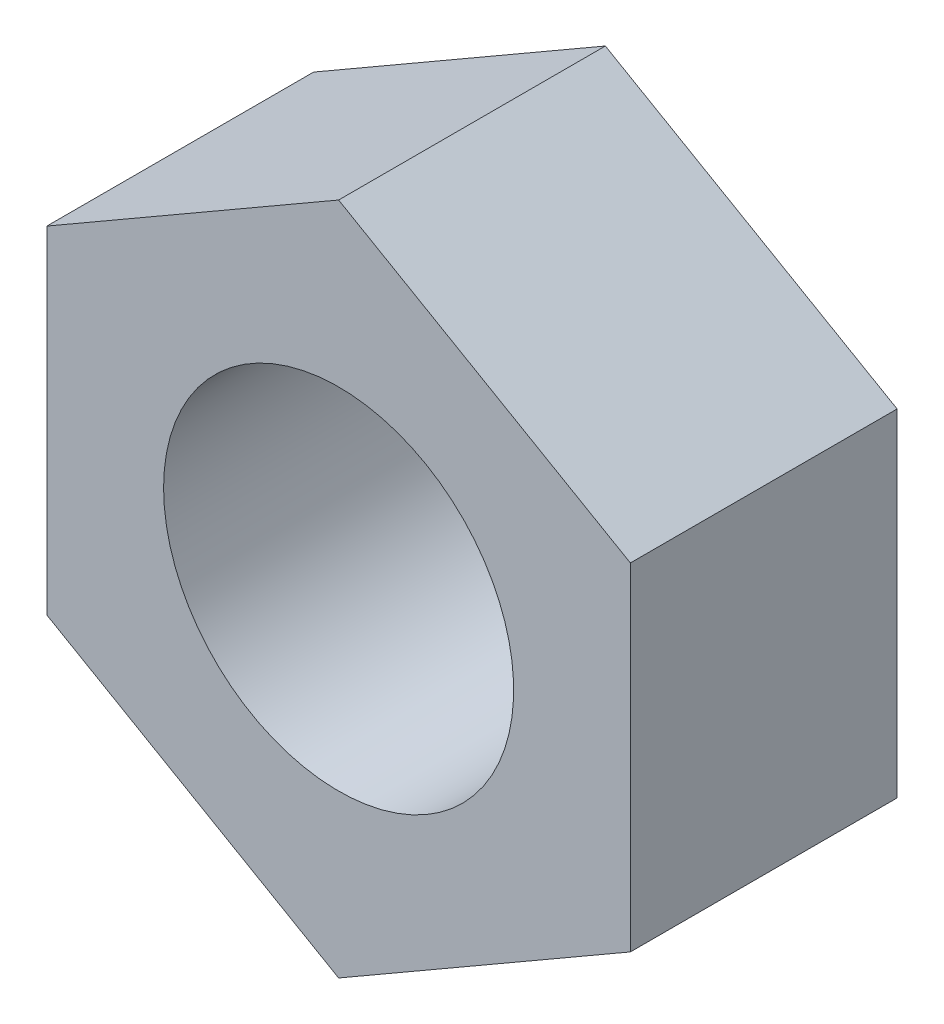
ISO-10303-21;
HEADER;
FILE_DESCRIPTION(('STEP AP214'),'2;1');
FILE_NAME('part.step','',(''),(''),'','','');
FILE_SCHEMA(('AUTOMOTIVE_DESIGN { 1 0 10303 214 1 1 1 1 }'));
ENDSEC;
DATA;
#1=APPLICATION_CONTEXT('core data for automotive mechanical design processes');
#2=APPLICATION_PROTOCOL_DEFINITION('international standard','automotive_design',2000,#1);
#3=PRODUCT_CONTEXT('',#1,'mechanical');
#4=PRODUCT('Part','Part','',(#3));
#5=PRODUCT_RELATED_PRODUCT_CATEGORY('part','',(#4));
#6=PRODUCT_DEFINITION_FORMATION('','',#4);
#7=PRODUCT_DEFINITION_CONTEXT('part definition',#1,'design');
#8=PRODUCT_DEFINITION('design','',#6,#7);
#9=PRODUCT_DEFINITION_SHAPE('','',#8);
#10=(LENGTH_UNIT() NAMED_UNIT(*) SI_UNIT(.MILLI.,.METRE.));
#11=(NAMED_UNIT(*) PLANE_ANGLE_UNIT() SI_UNIT($,.RADIAN.));
#12=(NAMED_UNIT(*) SI_UNIT($,.STERADIAN.) SOLID_ANGLE_UNIT());
#13=UNCERTAINTY_MEASURE_WITH_UNIT(LENGTH_MEASURE(1.E-05),#10,'distance_accuracy_value','');
#14=(GEOMETRIC_REPRESENTATION_CONTEXT(3) GLOBAL_UNCERTAINTY_ASSIGNED_CONTEXT((#13)) GLOBAL_UNIT_ASSIGNED_CONTEXT((#10,
#11,#12)) REPRESENTATION_CONTEXT('',''));
#15=CARTESIAN_POINT('',(0.,0.,0.));
#16=DIRECTION('',(0.,0.,1.));
#17=DIRECTION('',(1.,0.,0.));
#18=AXIS2_PLACEMENT_3D('',#15,#16,#17);
#19=CARTESIAN_POINT('',(0.,0.,0.));
#20=DIRECTION('',(0.,0.,-1.));
#21=DIRECTION('',(-1.,0.,0.));
#22=AXIS2_PLACEMENT_3D('',#19,#20,#21);
#23=CYLINDRICAL_SURFACE('',#22,2.1);
#24=CARTESIAN_POINT('',(0.,0.,-3.2));
#25=DIRECTION('',(0.,0.,-1.));
#26=DIRECTION('',(-1.,0.,0.));
#27=AXIS2_PLACEMENT_3D('',#24,#25,#26);
#28=CIRCLE('',#27,2.1);
#29=CARTESIAN_POINT('',(-2.1,0.,-3.2));
#30=VERTEX_POINT('',#29);
#31=EDGE_CURVE('E131',#30,#30,#28,.T.);
#32=ORIENTED_EDGE('',*,*,#31,.T.);
#33=EDGE_LOOP('',(#32));
#34=FACE_BOUND('',#33,.T.);
#35=CARTESIAN_POINT('',(0.,0.,0.));
#36=DIRECTION('',(0.,0.,-1.));
#37=DIRECTION('',(-1.,0.,0.));
#38=AXIS2_PLACEMENT_3D('',#35,#36,#37);
#39=CIRCLE('',#38,2.1);
#40=CARTESIAN_POINT('',(-2.1,0.,0.));
#41=VERTEX_POINT('',#40);
#42=EDGE_CURVE('E128',#41,#41,#39,.T.);
#43=ORIENTED_EDGE('',*,*,#42,.F.);
#44=EDGE_LOOP('',(#43));
#45=FACE_BOUND('',#44,.T.);
#46=ADVANCED_FACE('F17',(#34,#45),#23,.F.);
#47=CARTESIAN_POINT('',(-3.5,-2.020725942164,0.));
#48=DIRECTION('',(-0.50000000000019,-0.866025403784329,0.));
#49=DIRECTION('',(-0.866025403784329,0.50000000000019,0.));
#50=AXIS2_PLACEMENT_3D('',#47,#48,#49);
#51=PLANE('',#50);
#52=DIRECTION('',(0.,0.,-1.));
#53=VECTOR('',#52,1.);
#54=CARTESIAN_POINT('',(-3.5,-2.020725942164,0.));
#55=LINE('',#54,#53);
#56=CARTESIAN_POINT('',(-3.5,-2.020725942164,0.));
#57=VERTEX_POINT('',#56);
#58=CARTESIAN_POINT('',(-3.5,-2.020725942164,-3.2));
#59=VERTEX_POINT('',#58);
#60=EDGE_CURVE('E11',#57,#59,#55,.T.);
#61=ORIENTED_EDGE('',*,*,#60,.T.);
#62=DIRECTION('',(0.866025403784329,-0.50000000000019,0.));
#63=VECTOR('',#62,1.);
#64=CARTESIAN_POINT('',(-3.5,-2.020725942164,-3.2));
#65=LINE('',#64,#63);
#66=CARTESIAN_POINT('',(0.,-4.041451884327,-3.2));
#67=VERTEX_POINT('',#66);
#68=EDGE_CURVE('E118',#59,#67,#65,.T.);
#69=ORIENTED_EDGE('',*,*,#68,.T.);
#70=DIRECTION('',(0.,0.,-1.));
#71=VECTOR('',#70,1.);
#72=CARTESIAN_POINT('',(0.,-4.041451884327,0.));
#73=LINE('',#72,#71);
#74=CARTESIAN_POINT('',(0.,-4.041451884327,0.));
#75=VERTEX_POINT('',#74);
#76=EDGE_CURVE('E27',#75,#67,#73,.T.);
#77=ORIENTED_EDGE('',*,*,#76,.F.);
#78=DIRECTION('',(0.866025403784329,-0.50000000000019,0.));
#79=VECTOR('',#78,1.);
#80=CARTESIAN_POINT('',(-3.5,-2.020725942164,0.));
#81=LINE('',#80,#79);
#82=EDGE_CURVE('E140',#57,#75,#81,.T.);
#83=ORIENTED_EDGE('',*,*,#82,.F.);
#84=EDGE_LOOP('',(#61,#69,#77,#83));
#85=FACE_BOUND('',#84,.T.);
#86=ADVANCED_FACE('F19',(#85),#51,.T.);
#87=CARTESIAN_POINT('',(-3.5,2.020725942164,0.));
#88=DIRECTION('',(-1.,0.,0.));
#89=DIRECTION('',(0.,0.,1.));
#90=AXIS2_PLACEMENT_3D('',#87,#88,#89);
#91=PLANE('',#90);
#92=DIRECTION('',(0.,0.,-1.));
#93=VECTOR('',#92,1.);
#94=CARTESIAN_POINT('',(-3.5,2.020725942164,0.));
#95=LINE('',#94,#93);
#96=CARTESIAN_POINT('',(-3.5,2.020725942164,0.));
#97=VERTEX_POINT('',#96);
#98=CARTESIAN_POINT('',(-3.5,2.020725942164,-3.2));
#99=VERTEX_POINT('',#98);
#100=EDGE_CURVE('E146',#97,#99,#95,.T.);
#101=ORIENTED_EDGE('',*,*,#100,.T.);
#102=DIRECTION('',(0.,-1.,0.));
#103=VECTOR('',#102,1.);
#104=CARTESIAN_POINT('',(-3.5,2.020725942164,-3.2));
#105=LINE('',#104,#103);
#106=EDGE_CURVE('E125',#99,#59,#105,.T.);
#107=ORIENTED_EDGE('',*,*,#106,.T.);
#108=ORIENTED_EDGE('',*,*,#60,.F.);
#109=DIRECTION('',(0.,-1.,0.));
#110=VECTOR('',#109,1.);
#111=CARTESIAN_POINT('',(-3.5,2.020725942164,0.));
#112=LINE('',#111,#110);
#113=EDGE_CURVE('E142',#97,#57,#112,.T.);
#114=ORIENTED_EDGE('',*,*,#113,.F.);
#115=EDGE_LOOP('',(#101,#107,#108,#114));
#116=FACE_BOUND('',#115,.T.);
#117=ADVANCED_FACE('F226',(#116),#91,.T.);
#118=CARTESIAN_POINT('',(0.,-4.041451884327,0.));
#119=DIRECTION('',(0.50000000000019,-0.866025403784329,0.));
#120=DIRECTION('',(0.,0.,-1.));
#121=AXIS2_PLACEMENT_3D('',#118,#119,#120);
#122=PLANE('',#121);
#123=ORIENTED_EDGE('',*,*,#76,.T.);
#124=DIRECTION('',(0.866025403784329,0.50000000000019,0.));
#125=VECTOR('',#124,1.);
#126=CARTESIAN_POINT('',(0.,-4.041451884327,-3.2));
#127=LINE('',#126,#125);
#128=CARTESIAN_POINT('',(3.5,-2.020725942164,-3.2));
#129=VERTEX_POINT('',#128);
#130=EDGE_CURVE('E123',#67,#129,#127,.T.);
#131=ORIENTED_EDGE('',*,*,#130,.T.);
#132=DIRECTION('',(0.,0.,-1.));
#133=VECTOR('',#132,1.);
#134=CARTESIAN_POINT('',(3.5,-2.020725942164,0.));
#135=LINE('',#134,#133);
#136=CARTESIAN_POINT('',(3.5,-2.020725942164,0.));
#137=VERTEX_POINT('',#136);
#138=EDGE_CURVE('E94',#137,#129,#135,.T.);
#139=ORIENTED_EDGE('',*,*,#138,.F.);
#140=DIRECTION('',(0.866025403784329,0.50000000000019,0.));
#141=VECTOR('',#140,1.);
#142=CARTESIAN_POINT('',(0.,-4.041451884327,0.));
#143=LINE('',#142,#141);
#144=EDGE_CURVE('E143',#75,#137,#143,.T.);
#145=ORIENTED_EDGE('',*,*,#144,.F.);
#146=EDGE_LOOP('',(#123,#131,#139,#145));
#147=FACE_BOUND('',#146,.T.);
#148=ADVANCED_FACE('F220',(#147),#122,.T.);
#149=CARTESIAN_POINT('',(0.,0.,-3.2));
#150=DIRECTION('',(0.,0.,1.));
#151=DIRECTION('',(1.,0.,0.));
#152=AXIS2_PLACEMENT_3D('',#149,#150,#151);
#153=PLANE('',#152);
#154=ORIENTED_EDGE('',*,*,#31,.F.);
#155=EDGE_LOOP('',(#154));
#156=FACE_BOUND('',#155,.T.);
#157=DIRECTION('',(0.,1.,0.));
#158=VECTOR('',#157,1.);
#159=CARTESIAN_POINT('',(3.5,-2.020725942164,-3.2));
#160=LINE('',#159,#158);
#161=CARTESIAN_POINT('',(3.5,2.020725942164,-3.2));
#162=VERTEX_POINT('',#161);
#163=EDGE_CURVE('E87',#129,#162,#160,.T.);
#164=ORIENTED_EDGE('',*,*,#163,.F.);
#165=ORIENTED_EDGE('',*,*,#130,.F.);
#166=ORIENTED_EDGE('',*,*,#68,.F.);
#167=ORIENTED_EDGE('',*,*,#106,.F.);
#168=DIRECTION('',(-0.866025403784329,-0.50000000000019,0.));
#169=VECTOR('',#168,1.);
#170=CARTESIAN_POINT('',(0.,4.041451884327,-3.2));
#171=LINE('',#170,#169);
#172=CARTESIAN_POINT('',(0.,4.041451884327,-3.2));
#173=VERTEX_POINT('',#172);
#174=EDGE_CURVE('E102',#173,#99,#171,.T.);
#175=ORIENTED_EDGE('',*,*,#174,.F.);
#176=DIRECTION('',(-0.866025403784329,0.50000000000019,0.));
#177=VECTOR('',#176,1.);
#178=CARTESIAN_POINT('',(3.5,2.020725942164,-3.2));
#179=LINE('',#178,#177);
#180=EDGE_CURVE('E101',#162,#173,#179,.T.);
#181=ORIENTED_EDGE('',*,*,#180,.F.);
#182=EDGE_LOOP('',(#164,#165,#166,#167,#175,#181));
#183=FACE_BOUND('',#182,.T.);
#184=ADVANCED_FACE('F105',(#156,#183),#153,.F.);
#185=CARTESIAN_POINT('',(0.,0.,0.));
#186=DIRECTION('',(0.,0.,1.));
#187=DIRECTION('',(1.,0.,0.));
#188=AXIS2_PLACEMENT_3D('',#185,#186,#187);
#189=PLANE('',#188);
#190=ORIENTED_EDGE('',*,*,#42,.T.);
#191=EDGE_LOOP('',(#190));
#192=FACE_BOUND('',#191,.T.);
#193=DIRECTION('',(-0.866025403784329,0.50000000000019,0.));
#194=VECTOR('',#193,1.);
#195=CARTESIAN_POINT('',(3.5,2.020725942164,0.));
#196=LINE('',#195,#194);
#197=CARTESIAN_POINT('',(3.5,2.020725942164,0.));
#198=VERTEX_POINT('',#197);
#199=CARTESIAN_POINT('',(0.,4.041451884327,0.));
#200=VERTEX_POINT('',#199);
#201=EDGE_CURVE('E111',#198,#200,#196,.T.);
#202=ORIENTED_EDGE('',*,*,#201,.T.);
#203=DIRECTION('',(-0.866025403784329,-0.50000000000019,0.));
#204=VECTOR('',#203,1.);
#205=CARTESIAN_POINT('',(0.,4.041451884327,0.));
#206=LINE('',#205,#204);
#207=EDGE_CURVE('E148',#200,#97,#206,.T.);
#208=ORIENTED_EDGE('',*,*,#207,.T.);
#209=ORIENTED_EDGE('',*,*,#113,.T.);
#210=ORIENTED_EDGE('',*,*,#82,.T.);
#211=ORIENTED_EDGE('',*,*,#144,.T.);
#212=DIRECTION('',(0.,1.,0.));
#213=VECTOR('',#212,1.);
#214=CARTESIAN_POINT('',(3.5,-2.020725942164,0.));
#215=LINE('',#214,#213);
#216=EDGE_CURVE('E98',#137,#198,#215,.T.);
#217=ORIENTED_EDGE('',*,*,#216,.T.);
#218=EDGE_LOOP('',(#202,#208,#209,#210,#211,#217));
#219=FACE_BOUND('',#218,.T.);
#220=ADVANCED_FACE('F199',(#192,#219),#189,.T.);
#221=CARTESIAN_POINT('',(0.,4.041451884327,0.));
#222=DIRECTION('',(-0.50000000000019,0.866025403784329,0.));
#223=DIRECTION('',(0.,0.,1.));
#224=AXIS2_PLACEMENT_3D('',#221,#222,#223);
#225=PLANE('',#224);
#226=DIRECTION('',(0.,0.,-1.));
#227=VECTOR('',#226,1.);
#228=CARTESIAN_POINT('',(0.,4.041451884327,0.));
#229=LINE('',#228,#227);
#230=EDGE_CURVE('E108',#200,#173,#229,.T.);
#231=ORIENTED_EDGE('',*,*,#230,.T.);
#232=ORIENTED_EDGE('',*,*,#174,.T.);
#233=ORIENTED_EDGE('',*,*,#100,.F.);
#234=ORIENTED_EDGE('',*,*,#207,.F.);
#235=EDGE_LOOP('',(#231,#232,#233,#234));
#236=FACE_BOUND('',#235,.T.);
#237=ADVANCED_FACE('F195',(#236),#225,.T.);
#238=CARTESIAN_POINT('',(3.5,-2.020725942164,0.));
#239=DIRECTION('',(1.,0.,0.));
#240=DIRECTION('',(0.,1.,0.));
#241=AXIS2_PLACEMENT_3D('',#238,#239,#240);
#242=PLANE('',#241);
#243=ORIENTED_EDGE('',*,*,#138,.T.);
#244=ORIENTED_EDGE('',*,*,#163,.T.);
#245=DIRECTION('',(0.,0.,-1.));
#246=VECTOR('',#245,1.);
#247=CARTESIAN_POINT('',(3.5,2.020725942164,0.));
#248=LINE('',#247,#246);
#249=EDGE_CURVE('E95',#198,#162,#248,.T.);
#250=ORIENTED_EDGE('',*,*,#249,.F.);
#251=ORIENTED_EDGE('',*,*,#216,.F.);
#252=EDGE_LOOP('',(#243,#244,#250,#251));
#253=FACE_BOUND('',#252,.T.);
#254=ADVANCED_FACE('F90',(#253),#242,.T.);
#255=CARTESIAN_POINT('',(3.5,2.020725942164,0.));
#256=DIRECTION('',(0.50000000000019,0.866025403784329,0.));
#257=DIRECTION('',(0.,0.,-1.));
#258=AXIS2_PLACEMENT_3D('',#255,#256,#257);
#259=PLANE('',#258);
#260=ORIENTED_EDGE('',*,*,#249,.T.);
#261=ORIENTED_EDGE('',*,*,#180,.T.);
#262=ORIENTED_EDGE('',*,*,#230,.F.);
#263=ORIENTED_EDGE('',*,*,#201,.F.);
#264=EDGE_LOOP('',(#260,#261,#262,#263));
#265=FACE_BOUND('',#264,.T.);
#266=ADVANCED_FACE('F115',(#265),#259,.T.);
#267=CLOSED_SHELL('',(#46,#86,#117,#148,#184,#220,#237,#254,#266));
#268=MANIFOLD_SOLID_BREP('B1',#267);
#269=ADVANCED_BREP_SHAPE_REPRESENTATION('',(#18,#268),#14);
#270=SHAPE_DEFINITION_REPRESENTATION(#9,#269);
ENDSEC;
END-ISO-10303-21;
